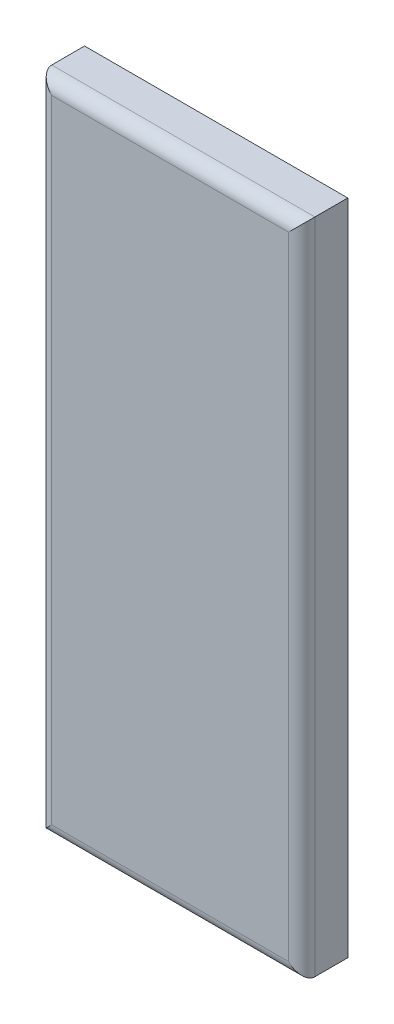
ISO-10303-21;
HEADER;
FILE_DESCRIPTION(('STEP AP214'),'2;1');
FILE_NAME('part.step','',(''),(''),'','','');
FILE_SCHEMA(('AUTOMOTIVE_DESIGN { 1 0 10303 214 1 1 1 1 }'));
ENDSEC;
DATA;
#1=APPLICATION_CONTEXT('core data for automotive mechanical design processes');
#2=APPLICATION_PROTOCOL_DEFINITION('international standard','automotive_design',2000,#1);
#3=PRODUCT_CONTEXT('',#1,'mechanical');
#4=PRODUCT('Part','Part','',(#3));
#5=PRODUCT_RELATED_PRODUCT_CATEGORY('part','',(#4));
#6=PRODUCT_DEFINITION_FORMATION('','',#4);
#7=PRODUCT_DEFINITION_CONTEXT('part definition',#1,'design');
#8=PRODUCT_DEFINITION('design','',#6,#7);
#9=PRODUCT_DEFINITION_SHAPE('','',#8);
#10=(LENGTH_UNIT() NAMED_UNIT(*) SI_UNIT(.MILLI.,.METRE.));
#11=(NAMED_UNIT(*) PLANE_ANGLE_UNIT() SI_UNIT($,.RADIAN.));
#12=(NAMED_UNIT(*) SI_UNIT($,.STERADIAN.) SOLID_ANGLE_UNIT());
#13=UNCERTAINTY_MEASURE_WITH_UNIT(LENGTH_MEASURE(1.E-05),#10,'distance_accuracy_value','');
#14=(GEOMETRIC_REPRESENTATION_CONTEXT(3) GLOBAL_UNCERTAINTY_ASSIGNED_CONTEXT((#13)) GLOBAL_UNIT_ASSIGNED_CONTEXT((#10,
#11,#12)) REPRESENTATION_CONTEXT('',''));
#15=CARTESIAN_POINT('',(0.,0.,0.));
#16=DIRECTION('',(0.,0.,1.));
#17=DIRECTION('',(1.,0.,0.));
#18=AXIS2_PLACEMENT_3D('',#15,#16,#17);
#19=CARTESIAN_POINT('',(20.,50.,7.));
#20=DIRECTION('',(-1.,0.,0.));
#21=DIRECTION('',(0.,-1.,0.));
#22=AXIS2_PLACEMENT_3D('',#19,#20,#21);
#23=PLANE('',#22);
#24=DIRECTION('',(0.,0.,-1.));
#25=VECTOR('',#24,1.);
#26=CARTESIAN_POINT('',(20.,50.,7.));
#27=LINE('',#26,#25);
#28=CARTESIAN_POINT('',(20.,50.,5.));
#29=VERTEX_POINT('',#28);
#30=CARTESIAN_POINT('',(20.,50.,0.));
#31=VERTEX_POINT('',#30);
#32=EDGE_CURVE('E83',#29,#31,#27,.T.);
#33=ORIENTED_EDGE('',*,*,#32,.F.);
#34=DIRECTION('',(0.,1.,0.));
#35=VECTOR('',#34,1.);
#36=CARTESIAN_POINT('',(20.,-50.,5.));
#37=LINE('',#36,#35);
#38=CARTESIAN_POINT('',(20.,-50.,5.));
#39=VERTEX_POINT('',#38);
#40=EDGE_CURVE('E41',#29,#39,#37,.F.);
#41=ORIENTED_EDGE('',*,*,#40,.T.);
#42=DIRECTION('',(0.,0.,-1.));
#43=VECTOR('',#42,1.);
#44=CARTESIAN_POINT('',(20.,-50.,7.));
#45=LINE('',#44,#43);
#46=CARTESIAN_POINT('',(20.,-50.,0.));
#47=VERTEX_POINT('',#46);
#48=EDGE_CURVE('E100',#39,#47,#45,.T.);
#49=ORIENTED_EDGE('',*,*,#48,.T.);
#50=DIRECTION('',(0.,1.,0.));
#51=VECTOR('',#50,1.);
#52=CARTESIAN_POINT('',(20.,50.,0.));
#53=LINE('',#52,#51);
#54=EDGE_CURVE('E96',#47,#31,#53,.T.);
#55=ORIENTED_EDGE('',*,*,#54,.T.);
#56=EDGE_LOOP('',(#33,#41,#49,#55));
#57=FACE_BOUND('',#56,.T.);
#58=ADVANCED_FACE('F32',(#57),#23,.F.);
#59=CARTESIAN_POINT('',(-20.,50.,7.));
#60=DIRECTION('',(0.,-1.,0.));
#61=DIRECTION('',(0.,0.,-1.));
#62=AXIS2_PLACEMENT_3D('',#59,#60,#61);
#63=PLANE('',#62);
#64=DIRECTION('',(0.,0.,-1.));
#65=VECTOR('',#64,1.);
#66=CARTESIAN_POINT('',(-20.,50.,7.));
#67=LINE('',#66,#65);
#68=CARTESIAN_POINT('',(-20.,50.,5.));
#69=VERTEX_POINT('',#68);
#70=CARTESIAN_POINT('',(-20.,50.,0.));
#71=VERTEX_POINT('',#70);
#72=EDGE_CURVE('E90',#69,#71,#67,.T.);
#73=ORIENTED_EDGE('',*,*,#72,.F.);
#74=DIRECTION('',(-1.,0.,0.));
#75=VECTOR('',#74,1.);
#76=CARTESIAN_POINT('',(20.,50.,5.));
#77=LINE('',#76,#75);
#78=EDGE_CURVE('E11',#69,#29,#77,.F.);
#79=ORIENTED_EDGE('',*,*,#78,.T.);
#80=ORIENTED_EDGE('',*,*,#32,.T.);
#81=DIRECTION('',(-1.,0.,0.));
#82=VECTOR('',#81,1.);
#83=CARTESIAN_POINT('',(-20.,50.,0.));
#84=LINE('',#83,#82);
#85=EDGE_CURVE('E86',#31,#71,#84,.T.);
#86=ORIENTED_EDGE('',*,*,#85,.T.);
#87=EDGE_LOOP('',(#73,#79,#80,#86));
#88=FACE_BOUND('',#87,.T.);
#89=ADVANCED_FACE('F85',(#88),#63,.F.);
#90=CARTESIAN_POINT('',(-20.,50.,7.));
#91=DIRECTION('',(1.,0.,0.));
#92=DIRECTION('',(0.,1.,0.));
#93=AXIS2_PLACEMENT_3D('',#90,#91,#92);
#94=PLANE('',#93);
#95=DIRECTION('',(0.,0.,-1.));
#96=VECTOR('',#95,1.);
#97=CARTESIAN_POINT('',(-20.,-50.,7.));
#98=LINE('',#97,#96);
#99=CARTESIAN_POINT('',(-20.,-50.,5.));
#100=VERTEX_POINT('',#99);
#101=CARTESIAN_POINT('',(-20.,-50.,0.));
#102=VERTEX_POINT('',#101);
#103=EDGE_CURVE('E110',#100,#102,#98,.T.);
#104=ORIENTED_EDGE('',*,*,#103,.F.);
#105=DIRECTION('',(0.,-1.,0.));
#106=VECTOR('',#105,1.);
#107=CARTESIAN_POINT('',(-20.,50.,5.));
#108=LINE('',#107,#106);
#109=EDGE_CURVE('E121',#100,#69,#108,.F.);
#110=ORIENTED_EDGE('',*,*,#109,.T.);
#111=ORIENTED_EDGE('',*,*,#72,.T.);
#112=DIRECTION('',(0.,-1.,0.));
#113=VECTOR('',#112,1.);
#114=CARTESIAN_POINT('',(-20.,50.,0.));
#115=LINE('',#114,#113);
#116=EDGE_CURVE('E98',#71,#102,#115,.T.);
#117=ORIENTED_EDGE('',*,*,#116,.T.);
#118=EDGE_LOOP('',(#104,#110,#111,#117));
#119=FACE_BOUND('',#118,.T.);
#120=ADVANCED_FACE('F150',(#119),#94,.F.);
#121=CARTESIAN_POINT('',(-20.,-50.,7.));
#122=DIRECTION('',(0.,1.,0.));
#123=DIRECTION('',(0.,0.,1.));
#124=AXIS2_PLACEMENT_3D('',#121,#122,#123);
#125=PLANE('',#124);
#126=ORIENTED_EDGE('',*,*,#48,.F.);
#127=DIRECTION('',(1.,0.,0.));
#128=VECTOR('',#127,1.);
#129=CARTESIAN_POINT('',(-20.,-50.,5.));
#130=LINE('',#129,#128);
#131=EDGE_CURVE('E124',#39,#100,#130,.F.);
#132=ORIENTED_EDGE('',*,*,#131,.T.);
#133=ORIENTED_EDGE('',*,*,#103,.T.);
#134=DIRECTION('',(1.,0.,0.));
#135=VECTOR('',#134,1.);
#136=CARTESIAN_POINT('',(-20.,-50.,0.));
#137=LINE('',#136,#135);
#138=EDGE_CURVE('E107',#102,#47,#137,.T.);
#139=ORIENTED_EDGE('',*,*,#138,.T.);
#140=EDGE_LOOP('',(#126,#132,#133,#139));
#141=FACE_BOUND('',#140,.T.);
#142=ADVANCED_FACE('F152',(#141),#125,.F.);
#143=CARTESIAN_POINT('',(0.,0.,7.));
#144=DIRECTION('',(0.,0.,1.));
#145=DIRECTION('',(1.,0.,0.));
#146=AXIS2_PLACEMENT_3D('',#143,#144,#145);
#147=PLANE('',#146);
#148=DIRECTION('',(-1.,0.,0.));
#149=VECTOR('',#148,1.);
#150=CARTESIAN_POINT('',(-20.,48.,7.));
#151=LINE('',#150,#149);
#152=CARTESIAN_POINT('',(18.,48.,7.));
#153=VERTEX_POINT('',#152);
#154=CARTESIAN_POINT('',(-18.,48.,7.));
#155=VERTEX_POINT('',#154);
#156=EDGE_CURVE('E89',#153,#155,#151,.T.);
#157=ORIENTED_EDGE('',*,*,#156,.T.);
#158=DIRECTION('',(0.,-1.,0.));
#159=VECTOR('',#158,1.);
#160=CARTESIAN_POINT('',(-18.,-50.,7.));
#161=LINE('',#160,#159);
#162=CARTESIAN_POINT('',(-18.,-48.,7.));
#163=VERTEX_POINT('',#162);
#164=EDGE_CURVE('E118',#155,#163,#161,.T.);
#165=ORIENTED_EDGE('',*,*,#164,.T.);
#166=DIRECTION('',(1.,0.,0.));
#167=VECTOR('',#166,1.);
#168=CARTESIAN_POINT('',(20.,-48.,7.));
#169=LINE('',#168,#167);
#170=CARTESIAN_POINT('',(18.,-48.,7.));
#171=VERTEX_POINT('',#170);
#172=EDGE_CURVE('E116',#163,#171,#169,.T.);
#173=ORIENTED_EDGE('',*,*,#172,.T.);
#174=DIRECTION('',(0.,1.,0.));
#175=VECTOR('',#174,1.);
#176=CARTESIAN_POINT('',(18.,50.,7.));
#177=LINE('',#176,#175);
#178=EDGE_CURVE('E114',#171,#153,#177,.T.);
#179=ORIENTED_EDGE('',*,*,#178,.T.);
#180=EDGE_LOOP('',(#157,#165,#173,#179));
#181=FACE_BOUND('',#180,.T.);
#182=ADVANCED_FACE('F142',(#181),#147,.T.);
#183=CARTESIAN_POINT('',(0.,0.,0.));
#184=DIRECTION('',(0.,0.,1.));
#185=DIRECTION('',(1.,0.,0.));
#186=AXIS2_PLACEMENT_3D('',#183,#184,#185);
#187=PLANE('',#186);
#188=ORIENTED_EDGE('',*,*,#54,.F.);
#189=ORIENTED_EDGE('',*,*,#138,.F.);
#190=ORIENTED_EDGE('',*,*,#116,.F.);
#191=ORIENTED_EDGE('',*,*,#85,.F.);
#192=EDGE_LOOP('',(#188,#189,#190,#191));
#193=FACE_BOUND('',#192,.T.);
#194=ADVANCED_FACE('F94',(#193),#187,.F.);
#195=CARTESIAN_POINT('',(18.,0.,5.));
#196=DIRECTION('',(0.,-1.,0.));
#197=DIRECTION('',(1.,0.,0.));
#198=AXIS2_PLACEMENT_3D('',#195,#196,#197);
#199=CYLINDRICAL_SURFACE('',#198,2.);
#200=CARTESIAN_POINT('',(18.,-48.,5.));
#201=DIRECTION('',(-0.707106781186547,-0.707106781186548,0.));
#202=DIRECTION('',(0.707106781186548,-0.707106781186547,0.));
#203=AXIS2_PLACEMENT_3D('',#200,#201,#202);
#204=ELLIPSE('',#203,2.82842712474619,2.);
#205=EDGE_CURVE('E104',#39,#171,#204,.T.);
#206=ORIENTED_EDGE('',*,*,#205,.F.);
#207=ORIENTED_EDGE('',*,*,#40,.F.);
#208=CARTESIAN_POINT('',(18.,48.,5.));
#209=DIRECTION('',(0.707106781186548,-0.707106781186547,0.));
#210=DIRECTION('',(0.707106781186547,0.707106781186548,0.));
#211=AXIS2_PLACEMENT_3D('',#208,#209,#210);
#212=ELLIPSE('',#211,2.82842712474619,2.);
#213=EDGE_CURVE('E36',#153,#29,#212,.F.);
#214=ORIENTED_EDGE('',*,*,#213,.F.);
#215=ORIENTED_EDGE('',*,*,#178,.F.);
#216=EDGE_LOOP('',(#206,#207,#214,#215));
#217=FACE_BOUND('',#216,.T.);
#218=ADVANCED_FACE('F34',(#217),#199,.T.);
#219=CARTESIAN_POINT('',(0.,48.,5.));
#220=DIRECTION('',(1.,0.,0.));
#221=DIRECTION('',(0.,0.,-1.));
#222=AXIS2_PLACEMENT_3D('',#219,#220,#221);
#223=CYLINDRICAL_SURFACE('',#222,2.);
#224=ORIENTED_EDGE('',*,*,#213,.T.);
#225=ORIENTED_EDGE('',*,*,#78,.F.);
#226=CARTESIAN_POINT('',(-18.,48.,5.));
#227=DIRECTION('',(0.707106781186547,0.707106781186548,0.));
#228=DIRECTION('',(0.707106781186548,-0.707106781186547,0.));
#229=AXIS2_PLACEMENT_3D('',#226,#227,#228);
#230=ELLIPSE('',#229,2.82842712474619,2.);
#231=EDGE_CURVE('E129',#155,#69,#230,.F.);
#232=ORIENTED_EDGE('',*,*,#231,.F.);
#233=ORIENTED_EDGE('',*,*,#156,.F.);
#234=EDGE_LOOP('',(#224,#225,#232,#233));
#235=FACE_BOUND('',#234,.T.);
#236=ADVANCED_FACE('F172',(#235),#223,.T.);
#237=CARTESIAN_POINT('',(0.,-48.,5.));
#238=DIRECTION('',(-1.,0.,0.));
#239=DIRECTION('',(0.,0.,1.));
#240=AXIS2_PLACEMENT_3D('',#237,#238,#239);
#241=CYLINDRICAL_SURFACE('',#240,2.);
#242=ORIENTED_EDGE('',*,*,#205,.T.);
#243=ORIENTED_EDGE('',*,*,#172,.F.);
#244=CARTESIAN_POINT('',(-18.,-48.,5.));
#245=DIRECTION('',(-0.707106781186548,0.707106781186547,0.));
#246=DIRECTION('',(-0.707106781186547,-0.707106781186548,0.));
#247=AXIS2_PLACEMENT_3D('',#244,#245,#246);
#248=ELLIPSE('',#247,2.82842712474619,2.);
#249=EDGE_CURVE('E127',#100,#163,#248,.T.);
#250=ORIENTED_EDGE('',*,*,#249,.F.);
#251=ORIENTED_EDGE('',*,*,#131,.F.);
#252=EDGE_LOOP('',(#242,#243,#250,#251));
#253=FACE_BOUND('',#252,.T.);
#254=ADVANCED_FACE('F135',(#253),#241,.T.);
#255=CARTESIAN_POINT('',(-18.,0.,5.));
#256=DIRECTION('',(0.,1.,0.));
#257=DIRECTION('',(-1.,0.,0.));
#258=AXIS2_PLACEMENT_3D('',#255,#256,#257);
#259=CYLINDRICAL_SURFACE('',#258,2.);
#260=ORIENTED_EDGE('',*,*,#231,.T.);
#261=ORIENTED_EDGE('',*,*,#109,.F.);
#262=ORIENTED_EDGE('',*,*,#249,.T.);
#263=ORIENTED_EDGE('',*,*,#164,.F.);
#264=EDGE_LOOP('',(#260,#261,#262,#263));
#265=FACE_BOUND('',#264,.T.);
#266=ADVANCED_FACE('F146',(#265),#259,.T.);
#267=CLOSED_SHELL('',(#58,#89,#120,#142,#182,#194,#218,#236,#254,#266));
#268=MANIFOLD_SOLID_BREP('B2',#267);
#269=ADVANCED_BREP_SHAPE_REPRESENTATION('',(#18,#268),#14);
#270=SHAPE_DEFINITION_REPRESENTATION(#9,#269);
ENDSEC;
END-ISO-10303-21;
